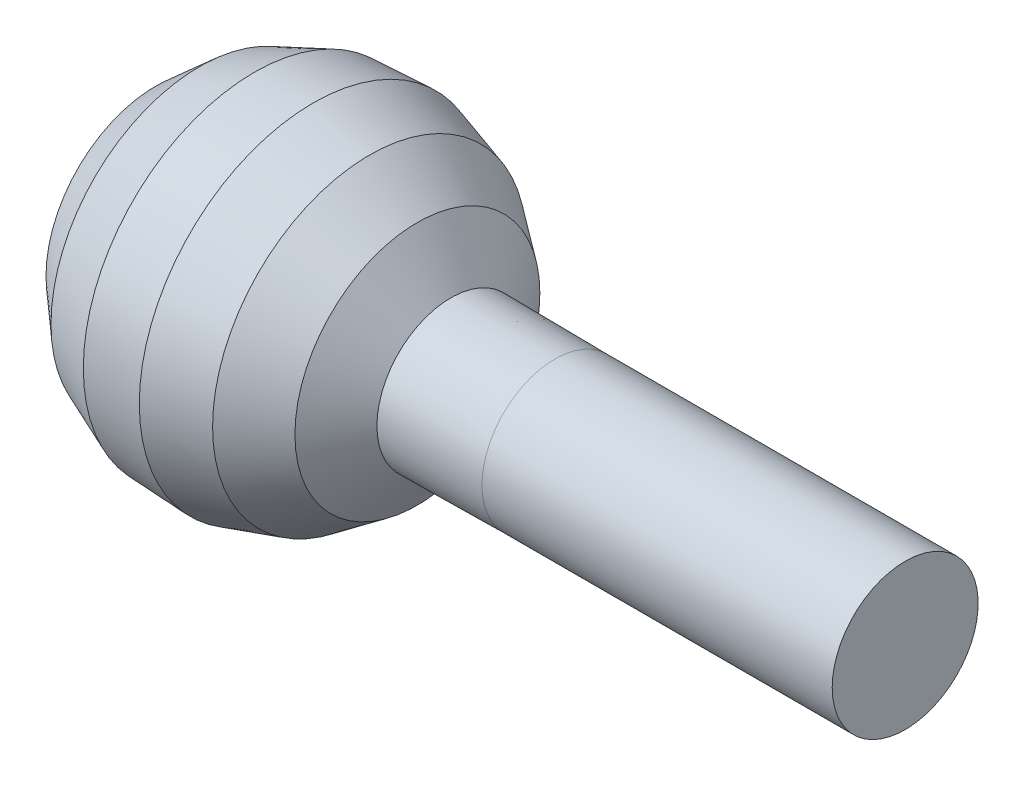
ISO-10303-21;
HEADER;
FILE_DESCRIPTION(('STEP AP214'),'2;1');
FILE_NAME('part.step','',(''),(''),'','','');
FILE_SCHEMA(('AUTOMOTIVE_DESIGN { 1 0 10303 214 1 1 1 1 }'));
ENDSEC;
DATA;
#1=APPLICATION_CONTEXT('core data for automotive mechanical design processes');
#2=APPLICATION_PROTOCOL_DEFINITION('international standard','automotive_design',2000,#1);
#3=PRODUCT_CONTEXT('',#1,'mechanical');
#4=PRODUCT('Part','Part','',(#3));
#5=PRODUCT_RELATED_PRODUCT_CATEGORY('part','',(#4));
#6=PRODUCT_DEFINITION_FORMATION('','',#4);
#7=PRODUCT_DEFINITION_CONTEXT('part definition',#1,'design');
#8=PRODUCT_DEFINITION('design','',#6,#7);
#9=PRODUCT_DEFINITION_SHAPE('','',#8);
#10=(LENGTH_UNIT() NAMED_UNIT(*) SI_UNIT(.MILLI.,.METRE.));
#11=(NAMED_UNIT(*) PLANE_ANGLE_UNIT() SI_UNIT($,.RADIAN.));
#12=(NAMED_UNIT(*) SI_UNIT($,.STERADIAN.) SOLID_ANGLE_UNIT());
#13=UNCERTAINTY_MEASURE_WITH_UNIT(LENGTH_MEASURE(1.E-05),#10,'distance_accuracy_value','');
#14=(GEOMETRIC_REPRESENTATION_CONTEXT(3) GLOBAL_UNCERTAINTY_ASSIGNED_CONTEXT((#13)) GLOBAL_UNIT_ASSIGNED_CONTEXT((#10,
#11,#12)) REPRESENTATION_CONTEXT('',''));
#15=CARTESIAN_POINT('',(0.,0.,0.));
#16=DIRECTION('',(0.,0.,1.));
#17=DIRECTION('',(1.,0.,0.));
#18=AXIS2_PLACEMENT_3D('',#15,#16,#17);
#19=CARTESIAN_POINT('',(6.,1.25,0.));
#20=DIRECTION('',(-1.,0.,0.));
#21=DIRECTION('',(0.,0.,1.));
#22=AXIS2_PLACEMENT_3D('',#19,#20,#21);
#23=PLANE('',#22);
#24=CARTESIAN_POINT('',(6.00000000000001,0.,0.));
#25=DIRECTION('',(-1.,0.,0.));
#26=DIRECTION('',(0.,0.,1.));
#27=AXIS2_PLACEMENT_3D('',#24,#25,#26);
#28=CIRCLE('',#27,1.25);
#29=CARTESIAN_POINT('',(6.00000000000001,0.,1.25));
#30=VERTEX_POINT('',#29);
#31=EDGE_CURVE('E11',#30,#30,#28,.T.);
#32=ORIENTED_EDGE('',*,*,#31,.F.);
#33=EDGE_LOOP('',(#32));
#34=FACE_BOUND('',#33,.T.);
#35=ADVANCED_FACE('F41',(#34),#23,.F.);
#36=CARTESIAN_POINT('',(-1000.,0.,0.));
#37=DIRECTION('',(-1.,0.,0.));
#38=DIRECTION('',(0.,0.,1.));
#39=AXIS2_PLACEMENT_3D('',#36,#37,#38);
#40=CYLINDRICAL_SURFACE('',#39,1.25);
#41=CARTESIAN_POINT('',(0.,0.,0.));
#42=DIRECTION('',(-1.,0.,0.));
#43=DIRECTION('',(0.,0.,1.));
#44=AXIS2_PLACEMENT_3D('',#41,#42,#43);
#45=CIRCLE('',#44,1.25);
#46=CARTESIAN_POINT('',(0.,0.,1.25));
#47=VERTEX_POINT('',#46);
#48=EDGE_CURVE('E50',#47,#47,#45,.T.);
#49=ORIENTED_EDGE('',*,*,#48,.F.);
#50=EDGE_LOOP('',(#49));
#51=FACE_BOUND('',#50,.T.);
#52=ORIENTED_EDGE('',*,*,#31,.T.);
#53=EDGE_LOOP('',(#52));
#54=FACE_BOUND('',#53,.T.);
#55=ADVANCED_FACE('F88',(#51,#54),#40,.T.);
#56=CARTESIAN_POINT('',(0.,0.,0.));
#57=DIRECTION('',(-1.,0.,0.));
#58=DIRECTION('',(0.,0.,1.));
#59=AXIS2_PLACEMENT_3D('',#56,#57,#58);
#60=CONICAL_SURFACE('',#59,1.25,0.0100243789421109);
#61=CARTESIAN_POINT('',(-1.78107663889004,0.,0.));
#62=DIRECTION('',(-1.,0.,0.));
#63=DIRECTION('',(0.,0.,1.));
#64=AXIS2_PLACEMENT_3D('',#61,#62,#63);
#65=CIRCLE('',#64,1.2678547852221);
#66=CARTESIAN_POINT('',(-1.78107663889004,0.,1.2678547852221));
#67=VERTEX_POINT('',#66);
#68=EDGE_CURVE('E77',#67,#67,#65,.T.);
#69=ORIENTED_EDGE('',*,*,#68,.F.);
#70=EDGE_LOOP('',(#69));
#71=FACE_BOUND('',#70,.T.);
#72=ORIENTED_EDGE('',*,*,#48,.T.);
#73=EDGE_LOOP('',(#72));
#74=FACE_BOUND('',#73,.T.);
#75=ADVANCED_FACE('F83',(#71,#74),#60,.T.);
#76=CARTESIAN_POINT('',(-1.78107663889004,0.,0.));
#77=DIRECTION('',(-1.,0.,0.));
#78=DIRECTION('',(0.,0.,1.));
#79=AXIS2_PLACEMENT_3D('',#76,#77,#78);
#80=CONICAL_SURFACE('',#79,1.2678547852221,0.965385242509341);
#81=CARTESIAN_POINT('',(-2.35566630799788,0.,0.));
#82=DIRECTION('',(-1.,0.,0.));
#83=DIRECTION('',(0.,0.,1.));
#84=AXIS2_PLACEMENT_3D('',#81,#82,#83);
#85=CIRCLE('',#84,2.0980545792101);
#86=CARTESIAN_POINT('',(-2.35566630799788,0.,2.0980545792101));
#87=VERTEX_POINT('',#86);
#88=EDGE_CURVE('E78',#87,#87,#85,.T.);
#89=ORIENTED_EDGE('',*,*,#88,.F.);
#90=EDGE_LOOP('',(#89));
#91=FACE_BOUND('',#90,.T.);
#92=ORIENTED_EDGE('',*,*,#68,.T.);
#93=EDGE_LOOP('',(#92));
#94=FACE_BOUND('',#93,.T.);
#95=ADVANCED_FACE('F106',(#91,#94),#80,.T.);
#96=CARTESIAN_POINT('',(-2.35566630799788,0.,0.));
#97=DIRECTION('',(-1.,0.,0.));
#98=DIRECTION('',(0.,0.,1.));
#99=AXIS2_PLACEMENT_3D('',#96,#97,#98);
#100=CONICAL_SURFACE('',#99,2.0980545792101,0.627227699935449);
#101=CARTESIAN_POINT('',(-3.17313392934304,0.,0.));
#102=DIRECTION('',(-1.,0.,0.));
#103=DIRECTION('',(0.,0.,1.));
#104=AXIS2_PLACEMENT_3D('',#101,#102,#103);
#105=CIRCLE('',#104,2.69061822459807);
#106=CARTESIAN_POINT('',(-3.17313392934304,0.,2.69061822459807));
#107=VERTEX_POINT('',#106);
#108=EDGE_CURVE('E71',#107,#107,#105,.T.);
#109=ORIENTED_EDGE('',*,*,#108,.F.);
#110=EDGE_LOOP('',(#109));
#111=FACE_BOUND('',#110,.T.);
#112=ORIENTED_EDGE('',*,*,#88,.T.);
#113=EDGE_LOOP('',(#112));
#114=FACE_BOUND('',#113,.T.);
#115=ADVANCED_FACE('F113',(#111,#114),#100,.T.);
#116=CARTESIAN_POINT('',(-3.17313392934304,0.,0.));
#117=DIRECTION('',(-1.,0.,0.));
#118=DIRECTION('',(0.,0.,1.));
#119=AXIS2_PLACEMENT_3D('',#116,#117,#118);
#120=CONICAL_SURFACE('',#119,2.69061822459807,0.28907015736156);
#121=CARTESIAN_POINT('',(-4.14088903408516,0.,0.));
#122=DIRECTION('',(-1.,0.,0.));
#123=DIRECTION('',(0.,0.,1.));
#124=AXIS2_PLACEMENT_3D('',#121,#122,#123);
#125=CIRCLE('',#124,2.97842900102717);
#126=CARTESIAN_POINT('',(-4.14088903408516,0.,2.97842900102717));
#127=VERTEX_POINT('',#126);
#128=EDGE_CURVE('E70',#127,#127,#125,.T.);
#129=ORIENTED_EDGE('',*,*,#128,.F.);
#130=EDGE_LOOP('',(#129));
#131=FACE_BOUND('',#130,.T.);
#132=ORIENTED_EDGE('',*,*,#108,.T.);
#133=EDGE_LOOP('',(#132));
#134=FACE_BOUND('',#133,.T.);
#135=ADVANCED_FACE('F123',(#131,#134),#120,.T.);
#136=CARTESIAN_POINT('',(-4.14088903408516,0.,0.));
#137=DIRECTION('',(1.,0.,0.));
#138=DIRECTION('',(0.,0.,-1.));
#139=AXIS2_PLACEMENT_3D('',#136,#137,#138);
#140=CONICAL_SURFACE('',#139,2.97842900102717,0.0490873852123409);
#141=CARTESIAN_POINT('',(-5.14931884181435,0.,0.));
#142=DIRECTION('',(-1.,0.,0.));
#143=DIRECTION('',(0.,0.,1.));
#144=AXIS2_PLACEMENT_3D('',#141,#142,#143);
#145=CIRCLE('',#144,2.9288880213598);
#146=CARTESIAN_POINT('',(-5.14931884181435,0.,2.9288880213598));
#147=VERTEX_POINT('',#146);
#148=EDGE_CURVE('E67',#147,#147,#145,.T.);
#149=ORIENTED_EDGE('',*,*,#148,.F.);
#150=EDGE_LOOP('',(#149));
#151=FACE_BOUND('',#150,.T.);
#152=ORIENTED_EDGE('',*,*,#128,.T.);
#153=EDGE_LOOP('',(#152));
#154=FACE_BOUND('',#153,.T.);
#155=ADVANCED_FACE('F131',(#151,#154),#140,.T.);
#156=CARTESIAN_POINT('',(-5.14931884181435,0.,0.));
#157=DIRECTION('',(1.,0.,0.));
#158=DIRECTION('',(0.,0.,-1.));
#159=AXIS2_PLACEMENT_3D('',#156,#157,#158);
#160=CONICAL_SURFACE('',#159,2.9288880213598,0.387244927786279);
#161=CARTESIAN_POINT('',(-6.08420355195105,0.,0.));
#162=DIRECTION('',(-1.,0.,0.));
#163=DIRECTION('',(0.,0.,1.));
#164=AXIS2_PLACEMENT_3D('',#161,#162,#163);
#165=CIRCLE('',#164,2.54760654457974);
#166=CARTESIAN_POINT('',(-6.08420355195105,0.,2.54760654457974));
#167=VERTEX_POINT('',#166);
#168=EDGE_CURVE('E65',#167,#167,#165,.T.);
#169=ORIENTED_EDGE('',*,*,#168,.F.);
#170=EDGE_LOOP('',(#169));
#171=FACE_BOUND('',#170,.T.);
#172=ORIENTED_EDGE('',*,*,#148,.T.);
#173=EDGE_LOOP('',(#172));
#174=FACE_BOUND('',#173,.T.);
#175=ADVANCED_FACE('F142',(#171,#174),#160,.T.);
#176=CARTESIAN_POINT('',(-6.08420355195105,0.,0.));
#177=DIRECTION('',(1.,0.,0.));
#178=DIRECTION('',(0.,0.,-1.));
#179=AXIS2_PLACEMENT_3D('',#176,#177,#178);
#180=CONICAL_SURFACE('',#179,2.54760654457974,0.725402470360128);
#181=CARTESIAN_POINT('',(-6.83965344927862,0.,0.));
#182=DIRECTION('',(-1.,0.,0.));
#183=DIRECTION('',(0.,0.,1.));
#184=AXIS2_PLACEMENT_3D('',#181,#182,#183);
#185=CIRCLE('',#184,1.87777041655218);
#186=CARTESIAN_POINT('',(-6.83965344927862,0.,1.87777041655218));
#187=VERTEX_POINT('',#186);
#188=EDGE_CURVE('E56',#187,#187,#185,.T.);
#189=ORIENTED_EDGE('',*,*,#188,.F.);
#190=EDGE_LOOP('',(#189));
#191=FACE_BOUND('',#190,.T.);
#192=ORIENTED_EDGE('',*,*,#168,.T.);
#193=EDGE_LOOP('',(#192));
#194=FACE_BOUND('',#193,.T.);
#195=ADVANCED_FACE('F151',(#191,#194),#180,.T.);
#196=CARTESIAN_POINT('',(-6.83965344927862,0.,0.));
#197=DIRECTION('',(1.,0.,0.));
#198=DIRECTION('',(0.,0.,-1.));
#199=AXIS2_PLACEMENT_3D('',#196,#197,#198);
#200=CONICAL_SURFACE('',#199,1.87777041655218,1.06356001293406);
#201=CARTESIAN_POINT('',(-7.33010250236943,0.,0.));
#202=DIRECTION('',(-1.,0.,0.));
#203=DIRECTION('',(0.,0.,1.));
#204=AXIS2_PLACEMENT_3D('',#201,#202,#203);
#205=CIRCLE('',#204,0.995248625260056);
#206=CARTESIAN_POINT('',(-7.33010250236943,0.,0.995248625260056));
#207=VERTEX_POINT('',#206);
#208=EDGE_CURVE('E60',#207,#207,#205,.T.);
#209=ORIENTED_EDGE('',*,*,#208,.F.);
#210=EDGE_LOOP('',(#209));
#211=FACE_BOUND('',#210,.T.);
#212=ORIENTED_EDGE('',*,*,#188,.T.);
#213=EDGE_LOOP('',(#212));
#214=FACE_BOUND('',#213,.T.);
#215=ADVANCED_FACE('F52',(#211,#214),#200,.T.);
#216=CARTESIAN_POINT('',(-7.33010250236943,0.,0.));
#217=DIRECTION('',(1.,0.,0.));
#218=DIRECTION('',(0.,0.,-1.));
#219=AXIS2_PLACEMENT_3D('',#216,#217,#218);
#220=CONICAL_SURFACE('',#219,0.995248625260056,1.40171755550794);
#221=CARTESIAN_POINT('',(-7.5,0.,0.));
#222=VERTEX_POINT('',#221);
#223=VERTEX_LOOP('',#222);
#224=FACE_BOUND('',#223,.T.);
#225=ORIENTED_EDGE('',*,*,#208,.T.);
#226=EDGE_LOOP('',(#225));
#227=FACE_BOUND('',#226,.T.);
#228=ADVANCED_FACE('F49',(#224,#227),#220,.T.);
#229=CLOSED_SHELL('',(#35,#55,#75,#95,#115,#135,#155,#175,#195,#215,#228));
#230=MANIFOLD_SOLID_BREP('B2',#229);
#231=ADVANCED_BREP_SHAPE_REPRESENTATION('',(#18,#230),#14);
#232=SHAPE_DEFINITION_REPRESENTATION(#9,#231);
ENDSEC;
END-ISO-10303-21;
